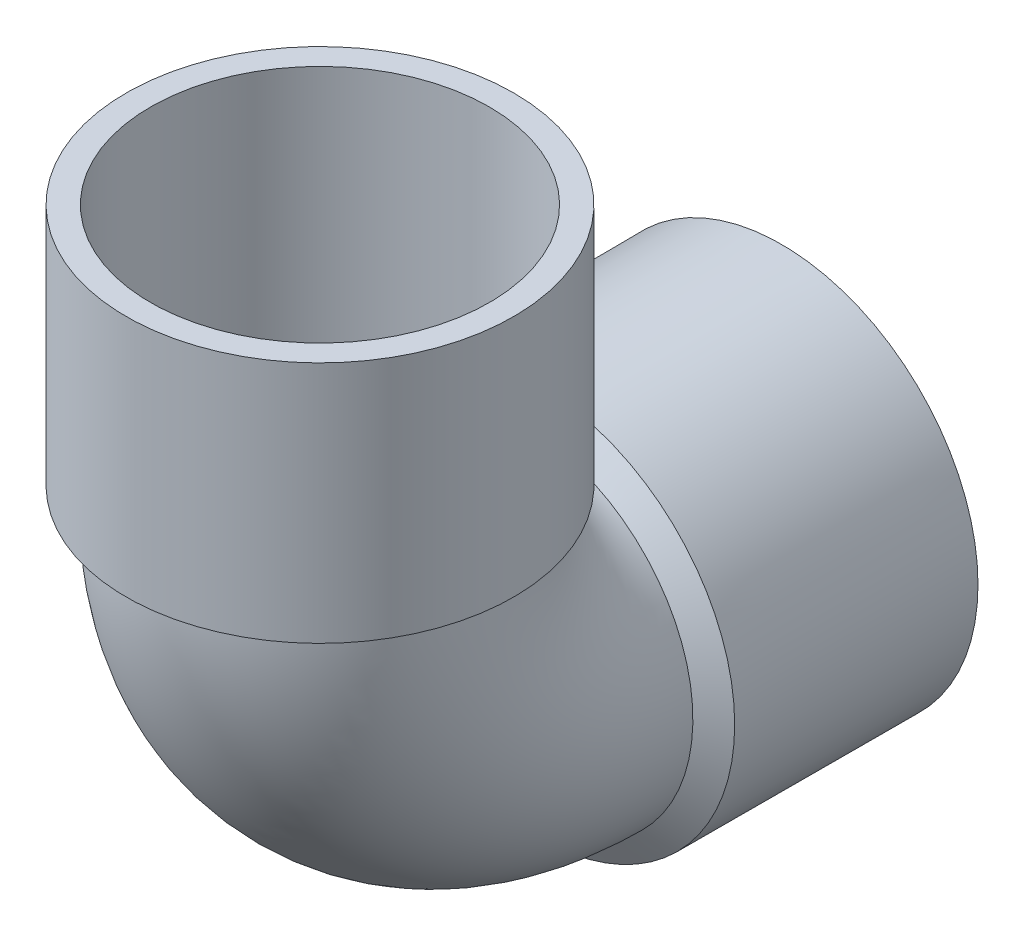
ISO-10303-21;
HEADER;
FILE_DESCRIPTION(('STEP AP214'),'2;1');
FILE_NAME('part.step','',(''),(''),'','','');
FILE_SCHEMA(('AUTOMOTIVE_DESIGN { 1 0 10303 214 1 1 1 1 }'));
ENDSEC;
DATA;
#1=APPLICATION_CONTEXT('core data for automotive mechanical design processes');
#2=APPLICATION_PROTOCOL_DEFINITION('international standard','automotive_design',2000,#1);
#3=PRODUCT_CONTEXT('',#1,'mechanical');
#4=PRODUCT('Part','Part','',(#3));
#5=PRODUCT_RELATED_PRODUCT_CATEGORY('part','',(#4));
#6=PRODUCT_DEFINITION_FORMATION('','',#4);
#7=PRODUCT_DEFINITION_CONTEXT('part definition',#1,'design');
#8=PRODUCT_DEFINITION('design','',#6,#7);
#9=PRODUCT_DEFINITION_SHAPE('','',#8);
#10=(LENGTH_UNIT() NAMED_UNIT(*) SI_UNIT(.MILLI.,.METRE.));
#11=(NAMED_UNIT(*) PLANE_ANGLE_UNIT() SI_UNIT($,.RADIAN.));
#12=(NAMED_UNIT(*) SI_UNIT($,.STERADIAN.) SOLID_ANGLE_UNIT());
#13=UNCERTAINTY_MEASURE_WITH_UNIT(LENGTH_MEASURE(1.E-05),#10,'distance_accuracy_value','');
#14=(GEOMETRIC_REPRESENTATION_CONTEXT(3) GLOBAL_UNCERTAINTY_ASSIGNED_CONTEXT((#13)) GLOBAL_UNIT_ASSIGNED_CONTEXT((#10,
#11,#12)) REPRESENTATION_CONTEXT('',''));
#15=CARTESIAN_POINT('',(0.,0.,0.));
#16=DIRECTION('',(0.,0.,1.));
#17=DIRECTION('',(1.,0.,0.));
#18=AXIS2_PLACEMENT_3D('',#15,#16,#17);
#19=CARTESIAN_POINT('',(0.,-2.45771382983375,-22.5870850391405));
#20=DIRECTION('',(-1.,0.,0.));
#21=DIRECTION('',(0.,0.,1.));
#22=AXIS2_PLACEMENT_3D('',#19,#20,#21);
#23=TOROIDAL_SURFACE('',#22,19.00377715,13.72452785773);
#24=CARTESIAN_POINT('',(0.,-21.4614909798338,-22.5870850391406));
#25=DIRECTION('',(0.,0.,1.));
#26=DIRECTION('',(0.,-1.,0.));
#27=AXIS2_PLACEMENT_3D('',#24,#25,#26);
#28=CIRCLE('',#27,13.72452785773);
#29=CARTESIAN_POINT('',(0.,-35.1860188375638,-22.5870850391406));
#30=VERTEX_POINT('',#29);
#31=EDGE_CURVE('E10',#30,#30,#28,.T.);
#32=CARTESIAN_POINT('',(0.,-2.45771382983375,-3.5833078891405));
#33=DIRECTION('',(0.,1.,0.));
#34=DIRECTION('',(0.,0.,1.));
#35=AXIS2_PLACEMENT_3D('',#32,#33,#34);
#36=CIRCLE('',#35,13.72452785773);
#37=CARTESIAN_POINT('',(0.,-2.45771382983375,10.1412199685895));
#38=VERTEX_POINT('',#37);
#39=EDGE_CURVE('E50',#38,#38,#36,.T.);
#40=CARTESIAN_POINT('',(0.,-2.45771382983375,-22.5870850391405));
#41=DIRECTION('',(-1.,0.,0.));
#42=DIRECTION('',(0.,0.,1.));
#43=AXIS2_PLACEMENT_3D('',#40,#41,#42);
#44=CIRCLE('',#43,32.72830500773);
#45=EDGE_CURVE('',#30,#38,#44,.T.);
#46=ORIENTED_EDGE('',*,*,#31,.F.);
#47=ORIENTED_EDGE('',*,*,#39,.T.);
#48=ORIENTED_EDGE('',*,*,#45,.T.);
#49=ORIENTED_EDGE('',*,*,#45,.F.);
#50=EDGE_LOOP('',(#46,#48,#47,#49));
#51=FACE_BOUND('',#50,.T.);
#52=ADVANCED_FACE('F39',(#51),#23,.F.);
#53=CARTESIAN_POINT('',(0.,-2.45771382983375,-22.5870850391405));
#54=DIRECTION('',(-1.,0.,0.));
#55=DIRECTION('',(0.,0.,1.));
#56=AXIS2_PLACEMENT_3D('',#53,#54,#55);
#57=TOROIDAL_SURFACE('',#56,19.00377715,16.00498111573);
#58=CARTESIAN_POINT('',(0.,-21.4614909798338,-22.5870850391406));
#59=DIRECTION('',(0.,0.,1.));
#60=DIRECTION('',(1.,0.,0.));
#61=AXIS2_PLACEMENT_3D('',#58,#59,#60);
#62=CIRCLE('',#61,16.00498111573);
#63=CARTESIAN_POINT('',(0.,-37.4664720955638,-22.5870850391407));
#64=VERTEX_POINT('',#63);
#65=EDGE_CURVE('E83',#64,#64,#62,.T.);
#66=CARTESIAN_POINT('',(0.,-2.45771382983375,-3.5833078891405));
#67=DIRECTION('',(0.,1.,0.));
#68=DIRECTION('',(0.,0.,1.));
#69=AXIS2_PLACEMENT_3D('',#66,#67,#68);
#70=CIRCLE('',#69,16.00498111573);
#71=CARTESIAN_POINT('',(0.,-2.45771382983375,12.4216732265895));
#72=VERTEX_POINT('',#71);
#73=EDGE_CURVE('E46',#72,#72,#70,.T.);
#74=CARTESIAN_POINT('',(0.,-2.45771382983375,-22.5870850391405));
#75=DIRECTION('',(-1.,0.,0.));
#76=DIRECTION('',(0.,0.,1.));
#77=AXIS2_PLACEMENT_3D('',#74,#75,#76);
#78=CIRCLE('',#77,35.00875826573);
#79=EDGE_CURVE('',#64,#72,#78,.T.);
#80=ORIENTED_EDGE('',*,*,#65,.T.);
#81=ORIENTED_EDGE('',*,*,#73,.F.);
#82=ORIENTED_EDGE('',*,*,#79,.T.);
#83=ORIENTED_EDGE('',*,*,#79,.F.);
#84=EDGE_LOOP('',(#80,#82,#81,#83));
#85=FACE_BOUND('',#84,.T.);
#86=ADVANCED_FACE('F41',(#85),#57,.T.);
#87=CARTESIAN_POINT('',(0.,-2.45771382983375,-3.5833078891405));
#88=DIRECTION('',(0.,1.,0.));
#89=DIRECTION('',(0.,0.,1.));
#90=AXIS2_PLACEMENT_3D('',#87,#88,#89);
#91=PLANE('',#90);
#92=CARTESIAN_POINT('',(0.,-2.45771382983375,-3.5833078891405));
#93=DIRECTION('',(0.,-1.,0.));
#94=DIRECTION('',(0.,0.,-1.));
#95=AXIS2_PLACEMENT_3D('',#92,#93,#94);
#96=CIRCLE('',#95,15.9039357772677);
#97=CARTESIAN_POINT('',(0.,-2.45771382983375,-19.4872436664082));
#98=VERTEX_POINT('',#97);
#99=EDGE_CURVE('E68',#98,#98,#96,.T.);
#100=ORIENTED_EDGE('',*,*,#99,.T.);
#101=EDGE_LOOP('',(#100));
#102=FACE_BOUND('',#101,.T.);
#103=ORIENTED_EDGE('',*,*,#73,.T.);
#104=EDGE_LOOP('',(#103));
#105=FACE_BOUND('',#104,.T.);
#106=ADVANCED_FACE('F114',(#102,#105),#91,.T.);
#107=CARTESIAN_POINT('',(0.,-2.45771382983375,-3.5833078891405));
#108=DIRECTION('',(0.,1.,0.));
#109=DIRECTION('',(0.,0.,1.));
#110=AXIS2_PLACEMENT_3D('',#107,#108,#109);
#111=CONICAL_SURFACE('',#110,13.6234825192677,0.983372069454364);
#112=CARTESIAN_POINT('',(0.,-0.937411657833754,-3.5833078891405));
#113=DIRECTION('',(0.,-1.,0.));
#114=DIRECTION('',(0.,0.,-1.));
#115=AXIS2_PLACEMENT_3D('',#112,#113,#114);
#116=CIRCLE('',#115,15.9067958569938);
#117=CARTESIAN_POINT('',(0.,-0.937411657833754,-19.4901037461343));
#118=VERTEX_POINT('',#117);
#119=EDGE_CURVE('E54',#118,#118,#116,.T.);
#120=ORIENTED_EDGE('',*,*,#119,.F.);
#121=EDGE_LOOP('',(#120));
#122=FACE_BOUND('',#121,.T.);
#123=CARTESIAN_POINT('',(0.,-2.45771382983375,-3.5833078891405));
#124=DIRECTION('',(0.,-1.,0.));
#125=DIRECTION('',(0.,0.,-1.));
#126=AXIS2_PLACEMENT_3D('',#123,#124,#125);
#127=CIRCLE('',#126,13.6234825192677);
#128=CARTESIAN_POINT('',(0.,-2.45771382983375,-17.2067904084082));
#129=VERTEX_POINT('',#128);
#130=EDGE_CURVE('E71',#129,#129,#127,.T.);
#131=ORIENTED_EDGE('',*,*,#130,.T.);
#132=EDGE_LOOP('',(#131));
#133=FACE_BOUND('',#132,.T.);
#134=ADVANCED_FACE('F120',(#122,#133),#111,.F.);
#135=CARTESIAN_POINT('',(0.,-2.45771382983375,-3.5833078891405));
#136=DIRECTION('',(0.,-1.,0.));
#137=DIRECTION('',(0.,0.,-1.));
#138=AXIS2_PLACEMENT_3D('',#135,#136,#137);
#139=CYLINDRICAL_SURFACE('',#138,15.9067958569938);
#140=CARTESIAN_POINT('',(0.,21.8671209221662,-3.5833078891405));
#141=DIRECTION('',(0.,-1.,0.));
#142=DIRECTION('',(0.,0.,-1.));
#143=AXIS2_PLACEMENT_3D('',#140,#141,#142);
#144=CIRCLE('',#143,15.9067958569938);
#145=CARTESIAN_POINT('',(0.,21.8671209221662,-19.4901037461343));
#146=VERTEX_POINT('',#145);
#147=EDGE_CURVE('E59',#146,#146,#144,.T.);
#148=ORIENTED_EDGE('',*,*,#147,.F.);
#149=EDGE_LOOP('',(#148));
#150=FACE_BOUND('',#149,.T.);
#151=ORIENTED_EDGE('',*,*,#119,.T.);
#152=EDGE_LOOP('',(#151));
#153=FACE_BOUND('',#152,.T.);
#154=ADVANCED_FACE('F124',(#150,#153),#139,.F.);
#155=CARTESIAN_POINT('',(0.,21.8671209221662,-3.5833078891405));
#156=DIRECTION('',(0.,1.,0.));
#157=DIRECTION('',(0.,0.,1.));
#158=AXIS2_PLACEMENT_3D('',#155,#156,#157);
#159=PLANE('',#158);
#160=ORIENTED_EDGE('',*,*,#147,.T.);
#161=EDGE_LOOP('',(#160));
#162=FACE_BOUND('',#161,.T.);
#163=CARTESIAN_POINT('',(0.,21.8671209221662,-3.5833078891405));
#164=DIRECTION('',(0.,-1.,0.));
#165=DIRECTION('',(0.,0.,-1.));
#166=AXIS2_PLACEMENT_3D('',#163,#164,#165);
#167=CIRCLE('',#166,18.1872491149938);
#168=CARTESIAN_POINT('',(0.,21.8671209221662,-21.7705570041343));
#169=VERTEX_POINT('',#168);
#170=EDGE_CURVE('E62',#169,#169,#167,.T.);
#171=ORIENTED_EDGE('',*,*,#170,.F.);
#172=EDGE_LOOP('',(#171));
#173=FACE_BOUND('',#172,.T.);
#174=ADVANCED_FACE('F128',(#162,#173),#159,.T.);
#175=CARTESIAN_POINT('',(0.,-2.45771382983375,-3.5833078891405));
#176=DIRECTION('',(0.,-1.,0.));
#177=DIRECTION('',(0.,0.,-1.));
#178=AXIS2_PLACEMENT_3D('',#175,#176,#177);
#179=CYLINDRICAL_SURFACE('',#178,18.1872491149938);
#180=ORIENTED_EDGE('',*,*,#170,.T.);
#181=EDGE_LOOP('',(#180));
#182=FACE_BOUND('',#181,.T.);
#183=CARTESIAN_POINT('',(0.,-0.937411657833754,-3.5833078891405));
#184=DIRECTION('',(0.,-1.,0.));
#185=DIRECTION('',(0.,0.,-1.));
#186=AXIS2_PLACEMENT_3D('',#183,#184,#185);
#187=CIRCLE('',#186,18.1872491149938);
#188=CARTESIAN_POINT('',(0.,-0.937411657833754,-21.7705570041343));
#189=VERTEX_POINT('',#188);
#190=EDGE_CURVE('E65',#189,#189,#187,.T.);
#191=ORIENTED_EDGE('',*,*,#190,.F.);
#192=EDGE_LOOP('',(#191));
#193=FACE_BOUND('',#192,.T.);
#194=ADVANCED_FACE('F132',(#182,#193),#179,.T.);
#195=CARTESIAN_POINT('',(0.,-2.45771382983375,-3.5833078891405));
#196=DIRECTION('',(0.,1.,0.));
#197=DIRECTION('',(0.,0.,1.));
#198=AXIS2_PLACEMENT_3D('',#195,#196,#197);
#199=CONICAL_SURFACE('',#198,15.9039357772677,0.983372069454364);
#200=ORIENTED_EDGE('',*,*,#190,.T.);
#201=EDGE_LOOP('',(#200));
#202=FACE_BOUND('',#201,.T.);
#203=ORIENTED_EDGE('',*,*,#99,.F.);
#204=EDGE_LOOP('',(#203));
#205=FACE_BOUND('',#204,.T.);
#206=ADVANCED_FACE('F106',(#202,#205),#199,.T.);
#207=CARTESIAN_POINT('',(0.,-2.45771382983375,-3.5833078891405));
#208=DIRECTION('',(0.,1.,0.));
#209=DIRECTION('',(0.,0.,1.));
#210=AXIS2_PLACEMENT_3D('',#207,#208,#209);
#211=PLANE('',#210);
#212=ORIENTED_EDGE('',*,*,#39,.F.);
#213=EDGE_LOOP('',(#212));
#214=FACE_BOUND('',#213,.T.);
#215=ORIENTED_EDGE('',*,*,#130,.F.);
#216=EDGE_LOOP('',(#215));
#217=FACE_BOUND('',#216,.T.);
#218=ADVANCED_FACE('F96',(#214,#217),#211,.F.);
#219=CARTESIAN_POINT('',(0.,-21.4614909798338,-24.1073872111406));
#220=DIRECTION('',(0.,0.,-1.));
#221=DIRECTION('',(-1.,0.,0.));
#222=AXIS2_PLACEMENT_3D('',#219,#220,#221);
#223=CONICAL_SURFACE('',#222,18.4088493029354,0.00159943632707392);
#224=CARTESIAN_POINT('',(0.,-21.4614909798338,-46.9119197911406));
#225=DIRECTION('',(0.,0.,1.));
#226=DIRECTION('',(1.,0.,0.));
#227=AXIS2_PLACEMENT_3D('',#224,#225,#226);
#228=CIRCLE('',#227,18.4453237318687);
#229=CARTESIAN_POINT('',(18.4453237318687,-21.4614909798338,-46.9119197911406));
#230=VERTEX_POINT('',#229);
#231=EDGE_CURVE('E74',#230,#230,#228,.T.);
#232=ORIENTED_EDGE('',*,*,#231,.T.);
#233=EDGE_LOOP('',(#232));
#234=FACE_BOUND('',#233,.T.);
#235=CARTESIAN_POINT('',(0.,-21.4614909798338,-24.1073872111406));
#236=DIRECTION('',(0.,0.,1.));
#237=DIRECTION('',(1.,0.,0.));
#238=AXIS2_PLACEMENT_3D('',#235,#236,#237);
#239=CIRCLE('',#238,18.4088493029354);
#240=CARTESIAN_POINT('',(18.4088493029354,-21.4614909798338,-24.1073872111406));
#241=VERTEX_POINT('',#240);
#242=EDGE_CURVE('E86',#241,#241,#239,.T.);
#243=ORIENTED_EDGE('',*,*,#242,.F.);
#244=EDGE_LOOP('',(#243));
#245=FACE_BOUND('',#244,.T.);
#246=ADVANCED_FACE('F93',(#234,#245),#223,.T.);
#247=CARTESIAN_POINT('',(0.,-2.45771382983375,-46.9119197911406));
#248=DIRECTION('',(0.,0.,-1.));
#249=DIRECTION('',(-1.,0.,0.));
#250=AXIS2_PLACEMENT_3D('',#247,#248,#249);
#251=PLANE('',#250);
#252=CARTESIAN_POINT('',(0.,-21.4614909798338,-46.9119197911406));
#253=DIRECTION('',(0.,0.,1.));
#254=DIRECTION('',(1.,0.,0.));
#255=AXIS2_PLACEMENT_3D('',#252,#253,#254);
#256=CIRCLE('',#255,16.1648704738688);
#257=CARTESIAN_POINT('',(16.1648704738688,-21.4614909798338,-46.9119197911406));
#258=VERTEX_POINT('',#257);
#259=EDGE_CURVE('E77',#258,#258,#256,.T.);
#260=ORIENTED_EDGE('',*,*,#259,.T.);
#261=EDGE_LOOP('',(#260));
#262=FACE_BOUND('',#261,.T.);
#263=ORIENTED_EDGE('',*,*,#231,.F.);
#264=EDGE_LOOP('',(#263));
#265=FACE_BOUND('',#264,.T.);
#266=ADVANCED_FACE('F95',(#262,#265),#251,.T.);
#267=CARTESIAN_POINT('',(0.,-21.4614909798338,-24.1073872111406));
#268=DIRECTION('',(0.,0.,-1.));
#269=DIRECTION('',(-1.,0.,0.));
#270=AXIS2_PLACEMENT_3D('',#267,#268,#269);
#271=CONICAL_SURFACE('',#270,16.1283960449354,0.00159943632707438);
#272=ORIENTED_EDGE('',*,*,#259,.F.);
#273=EDGE_LOOP('',(#272));
#274=FACE_BOUND('',#273,.T.);
#275=CARTESIAN_POINT('',(0.,-21.4614909798338,-24.1073872111406));
#276=DIRECTION('',(0.,0.,1.));
#277=DIRECTION('',(1.,0.,0.));
#278=AXIS2_PLACEMENT_3D('',#275,#276,#277);
#279=CIRCLE('',#278,16.1283960449354);
#280=CARTESIAN_POINT('',(16.1283960449354,-21.4614909798338,-24.1073872111406));
#281=VERTEX_POINT('',#280);
#282=EDGE_CURVE('E80',#281,#281,#279,.T.);
#283=ORIENTED_EDGE('',*,*,#282,.T.);
#284=EDGE_LOOP('',(#283));
#285=FACE_BOUND('',#284,.T.);
#286=ADVANCED_FACE('F103',(#274,#285),#271,.F.);
#287=CARTESIAN_POINT('',(0.,-21.4614909798338,-22.5870850391406));
#288=DIRECTION('',(0.,0.,-1.));
#289=DIRECTION('',(-1.,0.,0.));
#290=AXIS2_PLACEMENT_3D('',#287,#288,#289);
#291=CONICAL_SURFACE('',#290,13.72452785773,1.00686484647616);
#292=ORIENTED_EDGE('',*,*,#282,.F.);
#293=EDGE_LOOP('',(#292));
#294=FACE_BOUND('',#293,.T.);
#295=ORIENTED_EDGE('',*,*,#31,.T.);
#296=EDGE_LOOP('',(#295));
#297=FACE_BOUND('',#296,.T.);
#298=ADVANCED_FACE('F164',(#294,#297),#291,.F.);
#299=CARTESIAN_POINT('',(0.,-21.4614909798338,-22.5870850391406));
#300=DIRECTION('',(0.,0.,-1.));
#301=DIRECTION('',(-1.,0.,0.));
#302=AXIS2_PLACEMENT_3D('',#299,#300,#301);
#303=CONICAL_SURFACE('',#302,16.00498111573,1.00686484647616);
#304=ORIENTED_EDGE('',*,*,#242,.T.);
#305=EDGE_LOOP('',(#304));
#306=FACE_BOUND('',#305,.T.);
#307=ORIENTED_EDGE('',*,*,#65,.F.);
#308=EDGE_LOOP('',(#307));
#309=FACE_BOUND('',#308,.T.);
#310=ADVANCED_FACE('F90',(#306,#309),#303,.T.);
#311=CLOSED_SHELL('',(#52,#86,#106,#134,#154,#174,#194,#206,#218,#246,#266,#286,#298,#310));
#312=MANIFOLD_SOLID_BREP('B2',#311);
#313=ADVANCED_BREP_SHAPE_REPRESENTATION('',(#18,#312),#14);
#314=SHAPE_DEFINITION_REPRESENTATION(#9,#313);
ENDSEC;
END-ISO-10303-21;
